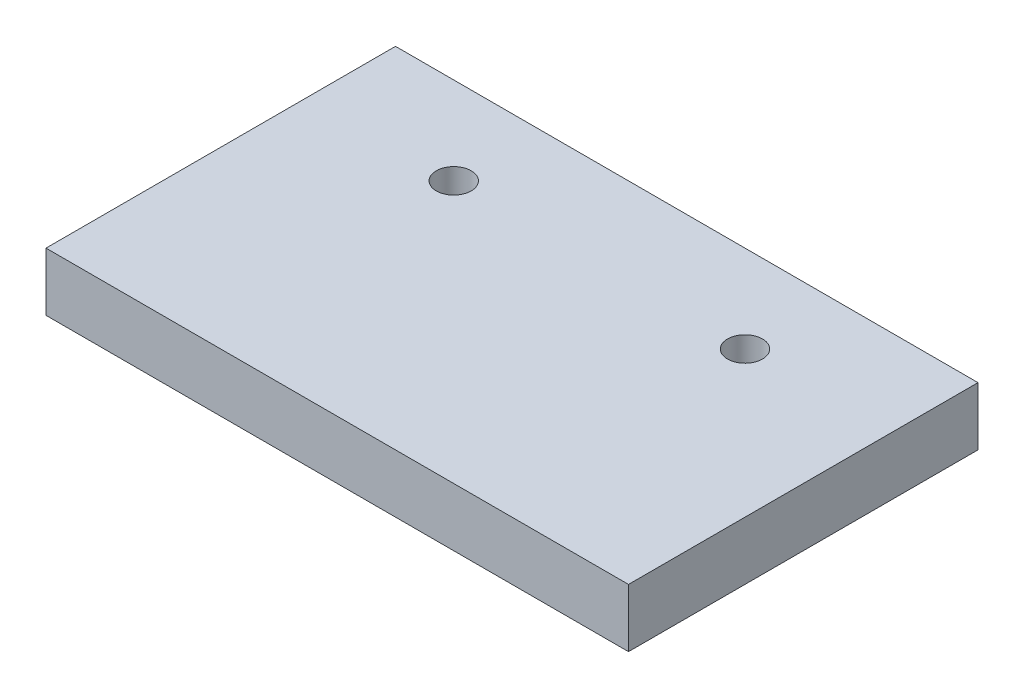
ISO-10303-21;
HEADER;
FILE_DESCRIPTION(('STEP AP214'),'2;1');
FILE_NAME('part.step','',(''),(''),'','','');
FILE_SCHEMA(('AUTOMOTIVE_DESIGN { 1 0 10303 214 1 1 1 1 }'));
ENDSEC;
DATA;
#1=APPLICATION_CONTEXT('core data for automotive mechanical design processes');
#2=APPLICATION_PROTOCOL_DEFINITION('international standard','automotive_design',2000,#1);
#3=PRODUCT_CONTEXT('',#1,'mechanical');
#4=PRODUCT('Part','Part','',(#3));
#5=PRODUCT_RELATED_PRODUCT_CATEGORY('part','',(#4));
#6=PRODUCT_DEFINITION_FORMATION('','',#4);
#7=PRODUCT_DEFINITION_CONTEXT('part definition',#1,'design');
#8=PRODUCT_DEFINITION('design','',#6,#7);
#9=PRODUCT_DEFINITION_SHAPE('','',#8);
#10=(LENGTH_UNIT() NAMED_UNIT(*) SI_UNIT(.MILLI.,.METRE.));
#11=(NAMED_UNIT(*) PLANE_ANGLE_UNIT() SI_UNIT($,.RADIAN.));
#12=(NAMED_UNIT(*) SI_UNIT($,.STERADIAN.) SOLID_ANGLE_UNIT());
#13=UNCERTAINTY_MEASURE_WITH_UNIT(LENGTH_MEASURE(1.E-05),#10,'distance_accuracy_value','');
#14=(GEOMETRIC_REPRESENTATION_CONTEXT(3) GLOBAL_UNCERTAINTY_ASSIGNED_CONTEXT((#13)) GLOBAL_UNIT_ASSIGNED_CONTEXT((#10,
#11,#12)) REPRESENTATION_CONTEXT('',''));
#15=CARTESIAN_POINT('',(0.,0.,0.));
#16=DIRECTION('',(0.,0.,1.));
#17=DIRECTION('',(1.,0.,0.));
#18=AXIS2_PLACEMENT_3D('',#15,#16,#17);
#19=CARTESIAN_POINT('',(50.,10.,30.));
#20=DIRECTION('',(-1.,0.,0.));
#21=DIRECTION('',(0.,0.,1.));
#22=AXIS2_PLACEMENT_3D('',#19,#20,#21);
#23=PLANE('',#22);
#24=DIRECTION('',(0.,0.,-1.));
#25=VECTOR('',#24,1.);
#26=CARTESIAN_POINT('',(50.,0.,30.));
#27=LINE('',#26,#25);
#28=CARTESIAN_POINT('',(50.,0.,30.));
#29=VERTEX_POINT('',#28);
#30=CARTESIAN_POINT('',(50.,0.,-30.));
#31=VERTEX_POINT('',#30);
#32=EDGE_CURVE('E102',#29,#31,#27,.T.);
#33=ORIENTED_EDGE('',*,*,#32,.T.);
#34=DIRECTION('',(0.,-1.,0.));
#35=VECTOR('',#34,1.);
#36=CARTESIAN_POINT('',(50.,10.,-30.));
#37=LINE('',#36,#35);
#38=CARTESIAN_POINT('',(50.,10.,-30.));
#39=VERTEX_POINT('',#38);
#40=EDGE_CURVE('E11',#39,#31,#37,.T.);
#41=ORIENTED_EDGE('',*,*,#40,.F.);
#42=DIRECTION('',(0.,0.,-1.));
#43=VECTOR('',#42,1.);
#44=CARTESIAN_POINT('',(50.,10.,30.));
#45=LINE('',#44,#43);
#46=CARTESIAN_POINT('',(50.,10.,30.));
#47=VERTEX_POINT('',#46);
#48=EDGE_CURVE('E90',#47,#39,#45,.T.);
#49=ORIENTED_EDGE('',*,*,#48,.F.);
#50=DIRECTION('',(0.,-1.,0.));
#51=VECTOR('',#50,1.);
#52=CARTESIAN_POINT('',(50.,10.,30.));
#53=LINE('',#52,#51);
#54=EDGE_CURVE('E98',#47,#29,#53,.T.);
#55=ORIENTED_EDGE('',*,*,#54,.T.);
#56=EDGE_LOOP('',(#33,#41,#49,#55));
#57=FACE_BOUND('',#56,.T.);
#58=ADVANCED_FACE('F39',(#57),#23,.F.);
#59=CARTESIAN_POINT('',(-50.,10.,-30.));
#60=DIRECTION('',(0.,0.,1.));
#61=DIRECTION('',(1.,0.,0.));
#62=AXIS2_PLACEMENT_3D('',#59,#60,#61);
#63=PLANE('',#62);
#64=DIRECTION('',(-1.,0.,0.));
#65=VECTOR('',#64,1.);
#66=CARTESIAN_POINT('',(-50.,0.,-30.));
#67=LINE('',#66,#65);
#68=CARTESIAN_POINT('',(-50.,0.,-30.));
#69=VERTEX_POINT('',#68);
#70=EDGE_CURVE('E94',#31,#69,#67,.T.);
#71=ORIENTED_EDGE('',*,*,#70,.T.);
#72=DIRECTION('',(0.,-1.,0.));
#73=VECTOR('',#72,1.);
#74=CARTESIAN_POINT('',(-50.,10.,-30.));
#75=LINE('',#74,#73);
#76=CARTESIAN_POINT('',(-50.,10.,-30.));
#77=VERTEX_POINT('',#76);
#78=EDGE_CURVE('E47',#77,#69,#75,.T.);
#79=ORIENTED_EDGE('',*,*,#78,.F.);
#80=DIRECTION('',(-1.,0.,0.));
#81=VECTOR('',#80,1.);
#82=CARTESIAN_POINT('',(-50.,10.,-30.));
#83=LINE('',#82,#81);
#84=EDGE_CURVE('E85',#39,#77,#83,.T.);
#85=ORIENTED_EDGE('',*,*,#84,.F.);
#86=ORIENTED_EDGE('',*,*,#40,.T.);
#87=EDGE_LOOP('',(#71,#79,#85,#86));
#88=FACE_BOUND('',#87,.T.);
#89=ADVANCED_FACE('F93',(#88),#63,.F.);
#90=CARTESIAN_POINT('',(-50.,10.,30.));
#91=DIRECTION('',(1.,0.,0.));
#92=DIRECTION('',(0.,0.,-1.));
#93=AXIS2_PLACEMENT_3D('',#90,#91,#92);
#94=PLANE('',#93);
#95=DIRECTION('',(0.,0.,1.));
#96=VECTOR('',#95,1.);
#97=CARTESIAN_POINT('',(-50.,0.,30.));
#98=LINE('',#97,#96);
#99=CARTESIAN_POINT('',(-50.,0.,30.));
#100=VERTEX_POINT('',#99);
#101=EDGE_CURVE('E72',#69,#100,#98,.T.);
#102=ORIENTED_EDGE('',*,*,#101,.T.);
#103=DIRECTION('',(0.,-1.,0.));
#104=VECTOR('',#103,1.);
#105=CARTESIAN_POINT('',(-50.,10.,30.));
#106=LINE('',#105,#104);
#107=CARTESIAN_POINT('',(-50.,10.,30.));
#108=VERTEX_POINT('',#107);
#109=EDGE_CURVE('E95',#108,#100,#106,.T.);
#110=ORIENTED_EDGE('',*,*,#109,.F.);
#111=DIRECTION('',(0.,0.,1.));
#112=VECTOR('',#111,1.);
#113=CARTESIAN_POINT('',(-50.,10.,30.));
#114=LINE('',#113,#112);
#115=EDGE_CURVE('E88',#77,#108,#114,.T.);
#116=ORIENTED_EDGE('',*,*,#115,.F.);
#117=ORIENTED_EDGE('',*,*,#78,.T.);
#118=EDGE_LOOP('',(#102,#110,#116,#117));
#119=FACE_BOUND('',#118,.T.);
#120=ADVANCED_FACE('F96',(#119),#94,.F.);
#121=CARTESIAN_POINT('',(-50.,10.,30.));
#122=DIRECTION('',(0.,0.,-1.));
#123=DIRECTION('',(-1.,0.,0.));
#124=AXIS2_PLACEMENT_3D('',#121,#122,#123);
#125=PLANE('',#124);
#126=DIRECTION('',(1.,0.,0.));
#127=VECTOR('',#126,1.);
#128=CARTESIAN_POINT('',(-50.,0.,30.));
#129=LINE('',#128,#127);
#130=EDGE_CURVE('E78',#100,#29,#129,.T.);
#131=ORIENTED_EDGE('',*,*,#130,.T.);
#132=ORIENTED_EDGE('',*,*,#54,.F.);
#133=DIRECTION('',(1.,0.,0.));
#134=VECTOR('',#133,1.);
#135=CARTESIAN_POINT('',(-50.,10.,30.));
#136=LINE('',#135,#134);
#137=EDGE_CURVE('E55',#108,#47,#136,.T.);
#138=ORIENTED_EDGE('',*,*,#137,.F.);
#139=ORIENTED_EDGE('',*,*,#109,.T.);
#140=EDGE_LOOP('',(#131,#132,#138,#139));
#141=FACE_BOUND('',#140,.T.);
#142=ADVANCED_FACE('F110',(#141),#125,.F.);
#143=CARTESIAN_POINT('',(0.,10.,0.));
#144=DIRECTION('',(0.,-1.,0.));
#145=DIRECTION('',(0.,0.,-1.));
#146=AXIS2_PLACEMENT_3D('',#143,#144,#145);
#147=PLANE('',#146);
#148=CARTESIAN_POINT('',(-25.,10.,-15.));
#149=DIRECTION('',(0.,-1.,0.));
#150=DIRECTION('',(0.,0.,-1.));
#151=AXIS2_PLACEMENT_3D('',#148,#149,#150);
#152=CIRCLE('',#151,3.);
#153=CARTESIAN_POINT('',(-25.,10.,-18.));
#154=VERTEX_POINT('',#153);
#155=EDGE_CURVE('E121',#154,#154,#152,.T.);
#156=ORIENTED_EDGE('',*,*,#155,.T.);
#157=EDGE_LOOP('',(#156));
#158=FACE_BOUND('',#157,.T.);
#159=CARTESIAN_POINT('',(25.,10.,-15.));
#160=DIRECTION('',(0.,-1.,0.));
#161=DIRECTION('',(0.,0.,-1.));
#162=AXIS2_PLACEMENT_3D('',#159,#160,#161);
#163=CIRCLE('',#162,3.);
#164=CARTESIAN_POINT('',(25.,10.,-18.));
#165=VERTEX_POINT('',#164);
#166=EDGE_CURVE('E105',#165,#165,#163,.F.);
#167=ORIENTED_EDGE('',*,*,#166,.F.);
#168=EDGE_LOOP('',(#167));
#169=FACE_BOUND('',#168,.T.);
#170=ORIENTED_EDGE('',*,*,#48,.T.);
#171=ORIENTED_EDGE('',*,*,#84,.T.);
#172=ORIENTED_EDGE('',*,*,#115,.T.);
#173=ORIENTED_EDGE('',*,*,#137,.T.);
#174=EDGE_LOOP('',(#170,#171,#172,#173));
#175=FACE_BOUND('',#174,.T.);
#176=ADVANCED_FACE('F86',(#158,#169,#175),#147,.F.);
#177=CARTESIAN_POINT('',(0.,0.,0.));
#178=DIRECTION('',(0.,-1.,0.));
#179=DIRECTION('',(0.,0.,-1.));
#180=AXIS2_PLACEMENT_3D('',#177,#178,#179);
#181=PLANE('',#180);
#182=CARTESIAN_POINT('',(-25.,0.,-15.));
#183=DIRECTION('',(0.,-1.,0.));
#184=DIRECTION('',(0.,0.,1.));
#185=AXIS2_PLACEMENT_3D('',#182,#183,#184);
#186=CIRCLE('',#185,3.);
#187=CARTESIAN_POINT('',(-25.,0.,-12.));
#188=VERTEX_POINT('',#187);
#189=EDGE_CURVE('E124',#188,#188,#186,.T.);
#190=ORIENTED_EDGE('',*,*,#189,.F.);
#191=EDGE_LOOP('',(#190));
#192=FACE_BOUND('',#191,.T.);
#193=CARTESIAN_POINT('',(25.,0.,-15.));
#194=DIRECTION('',(0.,1.,0.));
#195=DIRECTION('',(0.,0.,1.));
#196=AXIS2_PLACEMENT_3D('',#193,#194,#195);
#197=CIRCLE('',#196,3.);
#198=CARTESIAN_POINT('',(25.,0.,-12.));
#199=VERTEX_POINT('',#198);
#200=EDGE_CURVE('E118',#199,#199,#197,.T.);
#201=ORIENTED_EDGE('',*,*,#200,.T.);
#202=EDGE_LOOP('',(#201));
#203=FACE_BOUND('',#202,.T.);
#204=ORIENTED_EDGE('',*,*,#32,.F.);
#205=ORIENTED_EDGE('',*,*,#130,.F.);
#206=ORIENTED_EDGE('',*,*,#101,.F.);
#207=ORIENTED_EDGE('',*,*,#70,.F.);
#208=EDGE_LOOP('',(#204,#205,#206,#207));
#209=FACE_BOUND('',#208,.T.);
#210=ADVANCED_FACE('F113',(#192,#203,#209),#181,.T.);
#211=CARTESIAN_POINT('',(25.,20.,-15.));
#212=DIRECTION('',(0.,-1.,0.));
#213=DIRECTION('',(0.,0.,-1.));
#214=AXIS2_PLACEMENT_3D('',#211,#212,#213);
#215=CYLINDRICAL_SURFACE('',#214,3.);
#216=ORIENTED_EDGE('',*,*,#200,.F.);
#217=EDGE_LOOP('',(#216));
#218=FACE_BOUND('',#217,.T.);
#219=ORIENTED_EDGE('',*,*,#166,.T.);
#220=EDGE_LOOP('',(#219));
#221=FACE_BOUND('',#220,.T.);
#222=ADVANCED_FACE('F133',(#218,#221),#215,.F.);
#223=CARTESIAN_POINT('',(-25.,20.,-15.));
#224=DIRECTION('',(0.,-1.,0.));
#225=DIRECTION('',(0.,0.,-1.));
#226=AXIS2_PLACEMENT_3D('',#223,#224,#225);
#227=CYLINDRICAL_SURFACE('',#226,3.);
#228=ORIENTED_EDGE('',*,*,#189,.T.);
#229=EDGE_LOOP('',(#228));
#230=FACE_BOUND('',#229,.T.);
#231=ORIENTED_EDGE('',*,*,#155,.F.);
#232=EDGE_LOOP('',(#231));
#233=FACE_BOUND('',#232,.T.);
#234=ADVANCED_FACE('F128',(#230,#233),#227,.F.);
#235=CLOSED_SHELL('',(#58,#89,#120,#142,#176,#210,#222,#234));
#236=MANIFOLD_SOLID_BREP('B2',#235);
#237=ADVANCED_BREP_SHAPE_REPRESENTATION('',(#18,#236),#14);
#238=SHAPE_DEFINITION_REPRESENTATION(#9,#237);
ENDSEC;
END-ISO-10303-21;
